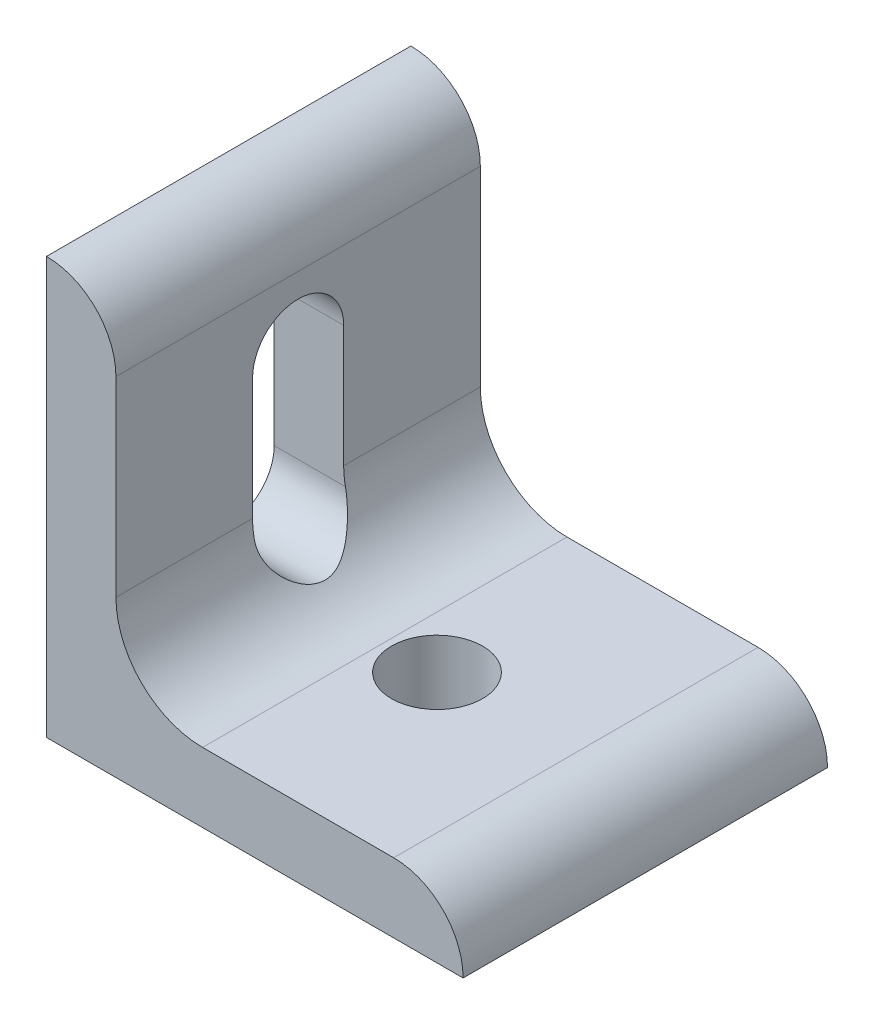
ISO-10303-21;
HEADER;
FILE_DESCRIPTION(('STEP AP214'),'2;1');
FILE_NAME('part.step','',(''),(''),'','','');
FILE_SCHEMA(('AUTOMOTIVE_DESIGN { 1 0 10303 214 1 1 1 1 }'));
ENDSEC;
DATA;
#1=APPLICATION_CONTEXT('core data for automotive mechanical design processes');
#2=APPLICATION_PROTOCOL_DEFINITION('international standard','automotive_design',2000,#1);
#3=PRODUCT_CONTEXT('',#1,'mechanical');
#4=PRODUCT('Part','Part','',(#3));
#5=PRODUCT_RELATED_PRODUCT_CATEGORY('part','',(#4));
#6=PRODUCT_DEFINITION_FORMATION('','',#4);
#7=PRODUCT_DEFINITION_CONTEXT('part definition',#1,'design');
#8=PRODUCT_DEFINITION('design','',#6,#7);
#9=PRODUCT_DEFINITION_SHAPE('','',#8);
#10=(LENGTH_UNIT() NAMED_UNIT(*) SI_UNIT(.MILLI.,.METRE.));
#11=(NAMED_UNIT(*) PLANE_ANGLE_UNIT() SI_UNIT($,.RADIAN.));
#12=(NAMED_UNIT(*) SI_UNIT($,.STERADIAN.) SOLID_ANGLE_UNIT());
#13=UNCERTAINTY_MEASURE_WITH_UNIT(LENGTH_MEASURE(1.E-05),#10,'distance_accuracy_value','');
#14=(GEOMETRIC_REPRESENTATION_CONTEXT(3) GLOBAL_UNCERTAINTY_ASSIGNED_CONTEXT((#13)) GLOBAL_UNIT_ASSIGNED_CONTEXT((#10,
#11,#12)) REPRESENTATION_CONTEXT('',''));
#15=CARTESIAN_POINT('',(0.,0.,0.));
#16=DIRECTION('',(0.,0.,1.));
#17=DIRECTION('',(1.,0.,0.));
#18=AXIS2_PLACEMENT_3D('',#15,#16,#17);
#19=CARTESIAN_POINT('',(-19.05,12.7,-16.6624));
#20=DIRECTION('',(0.,0.,1.));
#21=DIRECTION('',(1.,0.,0.));
#22=AXIS2_PLACEMENT_3D('',#19,#20,#21);
#23=CYLINDRICAL_SURFACE('',#22,6.35);
#24=DIRECTION('',(0.,0.,1.));
#25=VECTOR('',#24,1.);
#26=CARTESIAN_POINT('',(-19.05,19.05,-16.6624));
#27=LINE('',#26,#25);
#28=CARTESIAN_POINT('',(-19.05,19.05,-16.6624));
#29=VERTEX_POINT('',#28);
#30=CARTESIAN_POINT('',(-19.05,19.05,16.6624));
#31=VERTEX_POINT('',#30);
#32=EDGE_CURVE('E304',#29,#31,#27,.T.);
#33=ORIENTED_EDGE('',*,*,#32,.T.);
#34=CARTESIAN_POINT('',(-19.05,12.7,16.6624));
#35=DIRECTION('',(0.,0.,1.));
#36=DIRECTION('',(1.,0.,0.));
#37=AXIS2_PLACEMENT_3D('',#34,#35,#36);
#38=CIRCLE('',#37,6.35);
#39=CARTESIAN_POINT('',(-12.7,12.7,16.6624));
#40=VERTEX_POINT('',#39);
#41=EDGE_CURVE('E570',#40,#31,#38,.T.);
#42=ORIENTED_EDGE('',*,*,#41,.F.);
#43=DIRECTION('',(0.,0.,1.));
#44=VECTOR('',#43,1.);
#45=CARTESIAN_POINT('',(-12.7,12.7,-16.6624));
#46=LINE('',#45,#44);
#47=CARTESIAN_POINT('',(-12.7,12.7,-16.6624));
#48=VERTEX_POINT('',#47);
#49=EDGE_CURVE('E12',#48,#40,#46,.T.);
#50=ORIENTED_EDGE('',*,*,#49,.F.);
#51=CARTESIAN_POINT('',(-19.05,12.7,-16.6624));
#52=DIRECTION('',(0.,0.,1.));
#53=DIRECTION('',(1.,0.,0.));
#54=AXIS2_PLACEMENT_3D('',#51,#52,#53);
#55=CIRCLE('',#54,6.35);
#56=EDGE_CURVE('E544',#48,#29,#55,.T.);
#57=ORIENTED_EDGE('',*,*,#56,.T.);
#58=EDGE_LOOP('',(#33,#42,#50,#57));
#59=FACE_BOUND('',#58,.T.);
#60=ADVANCED_FACE('F301',(#59),#23,.T.);
#61=CARTESIAN_POINT('',(-12.7,-4.7752,-16.6624));
#62=DIRECTION('',(1.,0.,0.));
#63=DIRECTION('',(0.,0.,-1.));
#64=AXIS2_PLACEMENT_3D('',#61,#62,#63);
#65=PLANE('',#64);
#66=DIRECTION('',(0.,1.,0.));
#67=VECTOR('',#66,1.);
#68=CARTESIAN_POINT('',(-12.7,-4.77520000000001,-4.16560000000001));
#69=LINE('',#68,#67);
#70=CARTESIAN_POINT('',(-12.7,-4.7752,-4.16560000000001));
#71=VERTEX_POINT('',#70);
#72=CARTESIAN_POINT('',(-12.7,6.35,-4.1656));
#73=VERTEX_POINT('',#72);
#74=EDGE_CURVE('E487',#71,#73,#69,.T.);
#75=ORIENTED_EDGE('',*,*,#74,.F.);
#76=DIRECTION('',(0.,0.,1.));
#77=VECTOR('',#76,1.);
#78=CARTESIAN_POINT('',(-12.7,-4.7752,-16.6624));
#79=LINE('',#78,#77);
#80=CARTESIAN_POINT('',(-12.7,-4.7752,-16.6624));
#81=VERTEX_POINT('',#80);
#82=EDGE_CURVE('E310',#81,#71,#79,.T.);
#83=ORIENTED_EDGE('',*,*,#82,.F.);
#84=DIRECTION('',(0.,1.,0.));
#85=VECTOR('',#84,1.);
#86=CARTESIAN_POINT('',(-12.7,-4.7752,-16.6624));
#87=LINE('',#86,#85);
#88=EDGE_CURVE('E520',#81,#48,#87,.T.);
#89=ORIENTED_EDGE('',*,*,#88,.T.);
#90=ORIENTED_EDGE('',*,*,#49,.T.);
#91=DIRECTION('',(0.,1.,0.));
#92=VECTOR('',#91,1.);
#93=CARTESIAN_POINT('',(-12.7,-4.7752,16.6624));
#94=LINE('',#93,#92);
#95=CARTESIAN_POINT('',(-12.7,-4.7752,16.6624));
#96=VERTEX_POINT('',#95);
#97=EDGE_CURVE('E547',#96,#40,#94,.T.);
#98=ORIENTED_EDGE('',*,*,#97,.F.);
#99=CARTESIAN_POINT('',(-12.7,-4.7752,4.16560000000001));
#100=VERTEX_POINT('',#99);
#101=EDGE_CURVE('E499',#100,#96,#79,.T.);
#102=ORIENTED_EDGE('',*,*,#101,.F.);
#103=DIRECTION('',(0.,-1.,0.));
#104=VECTOR('',#103,1.);
#105=CARTESIAN_POINT('',(-12.7,-4.77520000000001,4.16560000000001));
#106=LINE('',#105,#104);
#107=CARTESIAN_POINT('',(-12.7,6.35,4.1656));
#108=VERTEX_POINT('',#107);
#109=EDGE_CURVE('E318',#108,#100,#106,.T.);
#110=ORIENTED_EDGE('',*,*,#109,.F.);
#111=CARTESIAN_POINT('',(-12.7,6.35,0.));
#112=DIRECTION('',(1.,0.,0.));
#113=DIRECTION('',(0.,0.,-1.));
#114=AXIS2_PLACEMENT_3D('',#111,#112,#113);
#115=CIRCLE('',#114,4.1656);
#116=EDGE_CURVE('E400',#73,#108,#115,.T.);
#117=ORIENTED_EDGE('',*,*,#116,.F.);
#118=EDGE_LOOP('',(#75,#83,#89,#90,#98,#102,#110,#117));
#119=FACE_BOUND('',#118,.T.);
#120=ADVANCED_FACE('F476',(#119),#65,.T.);
#121=CARTESIAN_POINT('',(-4.77520000000001,-4.7752,-16.6624));
#122=DIRECTION('',(0.,0.,1.));
#123=DIRECTION('',(1.,0.,0.));
#124=AXIS2_PLACEMENT_3D('',#121,#122,#123);
#125=CYLINDRICAL_SURFACE('',#124,7.9248);
#126=CARTESIAN_POINT('',(-4.77520000000001,-4.7752,-4.16560000000001));
#127=DIRECTION('',(0.,0.,-1.));
#128=DIRECTION('',(0.,1.,0.));
#129=AXIS2_PLACEMENT_3D('',#126,#127,#128);
#130=CIRCLE('',#129,7.9248);
#131=CARTESIAN_POINT('',(-12.5419535045217,-6.35,-4.16560000000001));
#132=VERTEX_POINT('',#131);
#133=EDGE_CURVE('E451',#132,#71,#130,.T.);
#134=ORIENTED_EDGE('',*,*,#133,.F.);
#135=CARTESIAN_POINT('',(-12.5419535045217,-6.35,4.1656));
#136=CARTESIAN_POINT('',(-12.5183677972555,-6.46644192340756,4.16561740535239));
#137=CARTESIAN_POINT('',(-12.4921253503843,-6.58230665657616,4.16071876942945));
#138=CARTESIAN_POINT('',(-12.4347124342698,-6.81191714210821,4.14150664543222));
#139=CARTESIAN_POINT('',(-12.4035461789697,-6.9256646142754,4.12720117520229));
#140=CARTESIAN_POINT('',(-12.3368501972341,-7.14953709792711,4.08971516347229));
#141=CARTESIAN_POINT('',(-12.3013505782604,-7.25968104101088,4.06659372747526));
#142=CARTESIAN_POINT('',(-12.2263025058469,-7.47644072382382,4.0119644114413));
#143=CARTESIAN_POINT('',(-12.1867532822909,-7.58305578734333,3.98045493441524));
#144=CARTESIAN_POINT('',(-12.0630690513076,-7.89601263454088,3.87432865818806));
#145=CARTESIAN_POINT('',(-11.973614662467,-8.09639780699546,3.78795143881343));
#146=CARTESIAN_POINT('',(-11.7849645675482,-8.47806539957021,3.58750983105808));
#147=CARTESIAN_POINT('',(-11.6857491693541,-8.65930760786181,3.47338876021334));
#148=CARTESIAN_POINT('',(-11.4699813110625,-9.02161399683833,3.2049341898041));
#149=CARTESIAN_POINT('',(-11.3527965347514,-9.19991989218349,3.04738262722771));
#150=CARTESIAN_POINT('',(-11.1199276687089,-9.52780854995298,2.70373754837415));
#151=CARTESIAN_POINT('',(-11.0042437072506,-9.67738887211559,2.51764160964141));
#152=CARTESIAN_POINT('',(-10.801497679007,-9.92374103399745,2.14977251920148));
#153=CARTESIAN_POINT('',(-10.7128061049432,-10.0251257718701,1.9719949281517));
#154=CARTESIAN_POINT('',(-10.5510474190907,-10.2025785095014,1.59767764113759));
#155=CARTESIAN_POINT('',(-10.4779512797623,-10.2786936926156,1.40117380436338));
#156=CARTESIAN_POINT('',(-10.3704080288697,-10.3877431182282,1.03748745676759));
#157=CARTESIAN_POINT('',(-10.3309746672691,-10.4265254239609,0.873562635560933));
#158=CARTESIAN_POINT('',(-10.2718246932586,-10.484080929987,0.538824344087069));
#159=CARTESIAN_POINT('',(-10.2520811365067,-10.5028814764687,0.368020621337604));
#160=CARTESIAN_POINT('',(-10.2350633067849,-10.5191113242346,0.0235525068248065));
#161=CARTESIAN_POINT('',(-10.2378775706813,-10.5164564149734,-0.150120484464315));
#162=CARTESIAN_POINT('',(-10.2657457566912,-10.4898031696545,-0.494041966253757));
#163=CARTESIAN_POINT('',(-10.2908190231559,-10.465786268765,-0.664287346324097));
#164=CARTESIAN_POINT('',(-10.3658159378943,-10.3921963096804,-1.02601276038822));
#165=CARTESIAN_POINT('',(-10.4193357580394,-10.3388701966739,-1.21595856593888));
#166=CARTESIAN_POINT('',(-10.5447415080306,-10.2087017632574,-1.5812737039262));
#167=CARTESIAN_POINT('',(-10.6166650118665,-10.1318112682243,-1.75661223077297));
#168=CARTESIAN_POINT('',(-10.7461550586974,-9.98636981896153,-2.03592724447349));
#169=CARTESIAN_POINT('',(-10.8006336783089,-9.92343154677005,-2.14436787754785));
#170=CARTESIAN_POINT('',(-10.9129577545909,-9.7889856904295,-2.35395380195964));
#171=CARTESIAN_POINT('',(-10.9708031584313,-9.71747824072524,-2.45509920771458));
#172=CARTESIAN_POINT('',(-11.088452518857,-9.56628447906911,-2.65009049694284));
#173=CARTESIAN_POINT('',(-11.1482589456436,-9.48658755886661,-2.74392662870047));
#174=CARTESIAN_POINT('',(-11.2684897949261,-9.31945343716514,-2.92397922756216));
#175=CARTESIAN_POINT('',(-11.3289141609528,-9.2320169374414,-3.01019638409209));
#176=CARTESIAN_POINT('',(-11.4502545238825,-9.04818847215568,-3.17609532271023));
#177=CARTESIAN_POINT('',(-11.5111622493259,-8.95167281802575,-3.25564621844662));
#178=CARTESIAN_POINT('',(-11.6313787475931,-8.75124355915059,-3.4061644336177));
#179=CARTESIAN_POINT('',(-11.6906876768444,-8.64733068180483,-3.47713259518089));
#180=CARTESIAN_POINT('',(-11.8065339104966,-8.43274314242526,-3.60974590493582));
#181=CARTESIAN_POINT('',(-11.8630786312437,-8.32208859234431,-3.67141704343744));
#182=CARTESIAN_POINT('',(-11.9726137702034,-8.09418652780175,-3.78500251768188));
#183=CARTESIAN_POINT('',(-12.0256042112055,-7.97693905562212,-3.8369169159877));
#184=CARTESIAN_POINT('',(-12.1253317491077,-7.74064757458649,-3.92858917841972));
#185=CARTESIAN_POINT('',(-12.1722225295559,-7.62180901379256,-3.96870802231849));
#186=CARTESIAN_POINT('',(-12.2610369929945,-7.37930769035314,-4.03839853103678));
#187=CARTESIAN_POINT('',(-12.3029622258882,-7.25564644912254,-4.06797349275737));
#188=CARTESIAN_POINT('',(-12.3814926670789,-7.00327806243865,-4.11607493407713));
#189=CARTESIAN_POINT('',(-12.4180476077657,-6.87453599255591,-4.13450150587616));
#190=CARTESIAN_POINT('',(-12.4848755918818,-6.6141189560806,-4.15928635187596));
#191=CARTESIAN_POINT('',(-12.5151404025939,-6.48244039247404,-4.16562889765033));
#192=CARTESIAN_POINT('',(-12.5419535045217,-6.35,-4.1656));
#193=B_SPLINE_CURVE_WITH_KNOTS('',3,(#135,#136,#137,#138,#139,#140,#141,#142,#143,#144,#145,
#146,#147,#148,#149,#150,#151,#152,#153,#154,#155,#156,#157,#158,#159,#160,#161,#162,#163,#164,
#165,#166,#167,#168,#169,#170,#171,#172,#173,#174,#175,#176,#177,#178,#179,#180,#181,#182,#183,
#184,#185,#186,#187,#188,#189,#190,#191,#192),.UNSPECIFIED.,.F.,.F.,(4,2,2,2,2,2,2,2,2,2,2,2,2,
2,2,2,2,2,2,2,2,2,2,2,2,2,2,2,4),(0.,0.356230564600409,0.712157891644707,1.0657397548369,
1.41938898426377,2.12376165412194,2.82958567821204,3.62213731146315,4.41475624289145,
5.08166429224455,5.74731999275772,6.26425629437072,6.78048422431451,7.29873927905102,
7.81744516857059,8.42741656536719,9.03864339127071,9.44829000204646,9.85793018657468,
10.2681078534863,10.6782483661516,11.0951378285751,11.5119863530162,11.9276470386122,
12.3433050587822,12.7444590989697,13.1454875945491,13.5500586889426,13.955156009535),.UNSPECIFIED.);
#194=CARTESIAN_POINT('',(-12.5419535045217,-6.35,4.16560000000001));
#195=VERTEX_POINT('',#194);
#196=EDGE_CURVE('E442',#195,#132,#193,.T.);
#197=ORIENTED_EDGE('',*,*,#196,.F.);
#198=CARTESIAN_POINT('',(-4.77520000000001,-4.7752,4.16560000000001));
#199=DIRECTION('',(0.,0.,1.));
#200=DIRECTION('',(0.,-1.,0.));
#201=AXIS2_PLACEMENT_3D('',#198,#199,#200);
#202=CIRCLE('',#201,7.9248);
#203=EDGE_CURVE('E431',#100,#195,#202,.T.);
#204=ORIENTED_EDGE('',*,*,#203,.F.);
#205=ORIENTED_EDGE('',*,*,#101,.T.);
#206=CARTESIAN_POINT('',(-4.77520000000001,-4.7752,16.6624));
#207=DIRECTION('',(0.,0.,-1.));
#208=DIRECTION('',(-1.,0.,0.));
#209=AXIS2_PLACEMENT_3D('',#206,#207,#208);
#210=CIRCLE('',#209,7.9248);
#211=CARTESIAN_POINT('',(-4.77520000000001,-12.7,16.6624));
#212=VERTEX_POINT('',#211);
#213=EDGE_CURVE('E551',#212,#96,#210,.T.);
#214=ORIENTED_EDGE('',*,*,#213,.F.);
#215=DIRECTION('',(0.,0.,1.));
#216=VECTOR('',#215,1.);
#217=CARTESIAN_POINT('',(-4.77520000000001,-12.7,-16.6624));
#218=LINE('',#217,#216);
#219=CARTESIAN_POINT('',(-4.77520000000001,-12.7,-16.6624));
#220=VERTEX_POINT('',#219);
#221=EDGE_CURVE('E503',#220,#212,#218,.T.);
#222=ORIENTED_EDGE('',*,*,#221,.F.);
#223=CARTESIAN_POINT('',(-4.77520000000001,-4.7752,-16.6624));
#224=DIRECTION('',(0.,0.,-1.));
#225=DIRECTION('',(-1.,0.,0.));
#226=AXIS2_PLACEMENT_3D('',#223,#224,#225);
#227=CIRCLE('',#226,7.9248);
#228=EDGE_CURVE('E496',#220,#81,#227,.T.);
#229=ORIENTED_EDGE('',*,*,#228,.T.);
#230=ORIENTED_EDGE('',*,*,#82,.T.);
#231=EDGE_LOOP('',(#134,#197,#204,#205,#214,#222,#229,#230));
#232=FACE_BOUND('',#231,.T.);
#233=ADVANCED_FACE('F453',(#232),#125,.F.);
#234=CARTESIAN_POINT('',(12.7,-12.7,-16.6624));
#235=DIRECTION('',(0.,1.,0.));
#236=DIRECTION('',(-1.,0.,0.));
#237=AXIS2_PLACEMENT_3D('',#234,#235,#236);
#238=PLANE('',#237);
#239=CARTESIAN_POINT('',(0.,-12.7,0.));
#240=DIRECTION('',(0.,1.,0.));
#241=DIRECTION('',(-1.,0.,0.));
#242=AXIS2_PLACEMENT_3D('',#239,#240,#241);
#243=CIRCLE('',#242,4.1656);
#244=CARTESIAN_POINT('',(-4.1656,-12.7,0.));
#245=VERTEX_POINT('',#244);
#246=EDGE_CURVE('E420',#245,#245,#243,.T.);
#247=ORIENTED_EDGE('',*,*,#246,.F.);
#248=EDGE_LOOP('',(#247));
#249=FACE_BOUND('',#248,.T.);
#250=ORIENTED_EDGE('',*,*,#221,.T.);
#251=DIRECTION('',(-1.,0.,0.));
#252=VECTOR('',#251,1.);
#253=CARTESIAN_POINT('',(12.7,-12.7,16.6624));
#254=LINE('',#253,#252);
#255=CARTESIAN_POINT('',(12.7,-12.7,16.6624));
#256=VERTEX_POINT('',#255);
#257=EDGE_CURVE('E555',#256,#212,#254,.T.);
#258=ORIENTED_EDGE('',*,*,#257,.F.);
#259=DIRECTION('',(0.,0.,1.));
#260=VECTOR('',#259,1.);
#261=CARTESIAN_POINT('',(12.7,-12.7,-16.6624));
#262=LINE('',#261,#260);
#263=CARTESIAN_POINT('',(12.7,-12.7,-16.6624));
#264=VERTEX_POINT('',#263);
#265=EDGE_CURVE('E508',#264,#256,#262,.T.);
#266=ORIENTED_EDGE('',*,*,#265,.F.);
#267=DIRECTION('',(-1.,0.,0.));
#268=VECTOR('',#267,1.);
#269=CARTESIAN_POINT('',(12.7,-12.7,-16.6624));
#270=LINE('',#269,#268);
#271=EDGE_CURVE('E527',#264,#220,#270,.T.);
#272=ORIENTED_EDGE('',*,*,#271,.T.);
#273=EDGE_LOOP('',(#250,#258,#266,#272));
#274=FACE_BOUND('',#273,.T.);
#275=ADVANCED_FACE('F482',(#249,#274),#238,.T.);
#276=CARTESIAN_POINT('',(12.7,-19.05,-16.6624));
#277=DIRECTION('',(0.,0.,1.));
#278=DIRECTION('',(1.,0.,0.));
#279=AXIS2_PLACEMENT_3D('',#276,#277,#278);
#280=CYLINDRICAL_SURFACE('',#279,6.35);
#281=ORIENTED_EDGE('',*,*,#265,.T.);
#282=CARTESIAN_POINT('',(12.7,-19.05,16.6624));
#283=DIRECTION('',(0.,0.,1.));
#284=DIRECTION('',(-1.,0.,0.));
#285=AXIS2_PLACEMENT_3D('',#282,#283,#284);
#286=CIRCLE('',#285,6.35);
#287=CARTESIAN_POINT('',(19.05,-19.05,16.6624));
#288=VERTEX_POINT('',#287);
#289=EDGE_CURVE('E559',#288,#256,#286,.T.);
#290=ORIENTED_EDGE('',*,*,#289,.F.);
#291=DIRECTION('',(0.,0.,1.));
#292=VECTOR('',#291,1.);
#293=CARTESIAN_POINT('',(19.05,-19.05,-16.6624));
#294=LINE('',#293,#292);
#295=CARTESIAN_POINT('',(19.05,-19.05,-16.6624));
#296=VERTEX_POINT('',#295);
#297=EDGE_CURVE('E511',#296,#288,#294,.T.);
#298=ORIENTED_EDGE('',*,*,#297,.F.);
#299=CARTESIAN_POINT('',(12.7,-19.05,-16.6624));
#300=DIRECTION('',(0.,0.,1.));
#301=DIRECTION('',(-1.,0.,0.));
#302=AXIS2_PLACEMENT_3D('',#299,#300,#301);
#303=CIRCLE('',#302,6.35);
#304=EDGE_CURVE('E533',#296,#264,#303,.T.);
#305=ORIENTED_EDGE('',*,*,#304,.T.);
#306=EDGE_LOOP('',(#281,#290,#298,#305));
#307=FACE_BOUND('',#306,.T.);
#308=ADVANCED_FACE('F602',(#307),#280,.T.);
#309=CARTESIAN_POINT('',(-19.05,-19.05,-16.6624));
#310=DIRECTION('',(0.,-1.,0.));
#311=DIRECTION('',(0.,0.,-1.));
#312=AXIS2_PLACEMENT_3D('',#309,#310,#311);
#313=PLANE('',#312);
#314=CARTESIAN_POINT('',(0.,-19.05,0.));
#315=DIRECTION('',(0.,1.,0.));
#316=DIRECTION('',(-1.,0.,0.));
#317=AXIS2_PLACEMENT_3D('',#314,#315,#316);
#318=CIRCLE('',#317,4.1656);
#319=CARTESIAN_POINT('',(-4.1656,-19.05,0.));
#320=VERTEX_POINT('',#319);
#321=EDGE_CURVE('E415',#320,#320,#318,.T.);
#322=ORIENTED_EDGE('',*,*,#321,.T.);
#323=EDGE_LOOP('',(#322));
#324=FACE_BOUND('',#323,.T.);
#325=ORIENTED_EDGE('',*,*,#297,.T.);
#326=DIRECTION('',(1.,0.,0.));
#327=VECTOR('',#326,1.);
#328=CARTESIAN_POINT('',(-19.05,-19.05,16.6624));
#329=LINE('',#328,#327);
#330=CARTESIAN_POINT('',(-19.05,-19.05,16.6624));
#331=VERTEX_POINT('',#330);
#332=EDGE_CURVE('E563',#331,#288,#329,.T.);
#333=ORIENTED_EDGE('',*,*,#332,.F.);
#334=DIRECTION('',(0.,0.,1.));
#335=VECTOR('',#334,1.);
#336=CARTESIAN_POINT('',(-19.05,-19.05,-16.6624));
#337=LINE('',#336,#335);
#338=CARTESIAN_POINT('',(-19.05,-19.05,-16.6624));
#339=VERTEX_POINT('',#338);
#340=EDGE_CURVE('E513',#339,#331,#337,.T.);
#341=ORIENTED_EDGE('',*,*,#340,.F.);
#342=DIRECTION('',(1.,0.,0.));
#343=VECTOR('',#342,1.);
#344=CARTESIAN_POINT('',(-19.05,-19.05,-16.6624));
#345=LINE('',#344,#343);
#346=EDGE_CURVE('E537',#339,#296,#345,.T.);
#347=ORIENTED_EDGE('',*,*,#346,.T.);
#348=EDGE_LOOP('',(#325,#333,#341,#347));
#349=FACE_BOUND('',#348,.T.);
#350=ADVANCED_FACE('F600',(#324,#349),#313,.T.);
#351=CARTESIAN_POINT('',(-19.05,19.05,-16.6624));
#352=DIRECTION('',(-1.,0.,0.));
#353=DIRECTION('',(0.,-1.,0.));
#354=AXIS2_PLACEMENT_3D('',#351,#352,#353);
#355=PLANE('',#354);
#356=CARTESIAN_POINT('',(-19.05,6.35,0.));
#357=DIRECTION('',(1.,0.,0.));
#358=DIRECTION('',(0.,0.,-1.));
#359=AXIS2_PLACEMENT_3D('',#356,#357,#358);
#360=CIRCLE('',#359,4.1656);
#361=CARTESIAN_POINT('',(-19.05,6.35,-4.1656));
#362=VERTEX_POINT('',#361);
#363=CARTESIAN_POINT('',(-19.05,6.35,4.1656));
#364=VERTEX_POINT('',#363);
#365=EDGE_CURVE('E397',#362,#364,#360,.T.);
#366=ORIENTED_EDGE('',*,*,#365,.T.);
#367=DIRECTION('',(0.,-1.,0.));
#368=VECTOR('',#367,1.);
#369=CARTESIAN_POINT('',(-19.05,6.35,4.1656));
#370=LINE('',#369,#368);
#371=CARTESIAN_POINT('',(-19.05,-6.34999999999999,4.1656));
#372=VERTEX_POINT('',#371);
#373=EDGE_CURVE('E406',#364,#372,#370,.T.);
#374=ORIENTED_EDGE('',*,*,#373,.T.);
#375=CARTESIAN_POINT('',(-19.05,-6.35,0.));
#376=DIRECTION('',(1.,0.,0.));
#377=DIRECTION('',(0.,0.,-1.));
#378=AXIS2_PLACEMENT_3D('',#375,#376,#377);
#379=CIRCLE('',#378,4.1656);
#380=CARTESIAN_POINT('',(-19.05,-6.35,-4.16560000000001));
#381=VERTEX_POINT('',#380);
#382=EDGE_CURVE('E326',#372,#381,#379,.T.);
#383=ORIENTED_EDGE('',*,*,#382,.T.);
#384=DIRECTION('',(0.,1.,0.));
#385=VECTOR('',#384,1.);
#386=CARTESIAN_POINT('',(-19.05,6.35,-4.1656));
#387=LINE('',#386,#385);
#388=EDGE_CURVE('E403',#381,#362,#387,.T.);
#389=ORIENTED_EDGE('',*,*,#388,.T.);
#390=EDGE_LOOP('',(#366,#374,#383,#389));
#391=FACE_BOUND('',#390,.T.);
#392=ORIENTED_EDGE('',*,*,#340,.T.);
#393=DIRECTION('',(0.,-1.,0.));
#394=VECTOR('',#393,1.);
#395=CARTESIAN_POINT('',(-19.05,19.05,16.6624));
#396=LINE('',#395,#394);
#397=EDGE_CURVE('E567',#31,#331,#396,.T.);
#398=ORIENTED_EDGE('',*,*,#397,.F.);
#399=ORIENTED_EDGE('',*,*,#32,.F.);
#400=DIRECTION('',(0.,-1.,0.));
#401=VECTOR('',#400,1.);
#402=CARTESIAN_POINT('',(-19.05,19.05,-16.6624));
#403=LINE('',#402,#401);
#404=EDGE_CURVE('E541',#29,#339,#403,.T.);
#405=ORIENTED_EDGE('',*,*,#404,.T.);
#406=EDGE_LOOP('',(#392,#398,#399,#405));
#407=FACE_BOUND('',#406,.T.);
#408=ADVANCED_FACE('F411',(#391,#407),#355,.T.);
#409=CARTESIAN_POINT('',(-19.05,12.7,-16.6624));
#410=DIRECTION('',(0.,0.,1.));
#411=DIRECTION('',(1.,0.,0.));
#412=AXIS2_PLACEMENT_3D('',#409,#410,#411);
#413=PLANE('',#412);
#414=ORIENTED_EDGE('',*,*,#56,.F.);
#415=ORIENTED_EDGE('',*,*,#88,.F.);
#416=ORIENTED_EDGE('',*,*,#228,.F.);
#417=ORIENTED_EDGE('',*,*,#271,.F.);
#418=ORIENTED_EDGE('',*,*,#304,.F.);
#419=ORIENTED_EDGE('',*,*,#346,.F.);
#420=ORIENTED_EDGE('',*,*,#404,.F.);
#421=EDGE_LOOP('',(#414,#415,#416,#417,#418,#419,#420));
#422=FACE_BOUND('',#421,.T.);
#423=ADVANCED_FACE('F472',(#422),#413,.F.);
#424=CARTESIAN_POINT('',(-19.05,12.7,16.6624));
#425=DIRECTION('',(0.,0.,1.));
#426=DIRECTION('',(1.,0.,0.));
#427=AXIS2_PLACEMENT_3D('',#424,#425,#426);
#428=PLANE('',#427);
#429=ORIENTED_EDGE('',*,*,#41,.T.);
#430=ORIENTED_EDGE('',*,*,#397,.T.);
#431=ORIENTED_EDGE('',*,*,#332,.T.);
#432=ORIENTED_EDGE('',*,*,#289,.T.);
#433=ORIENTED_EDGE('',*,*,#257,.T.);
#434=ORIENTED_EDGE('',*,*,#213,.T.);
#435=ORIENTED_EDGE('',*,*,#97,.T.);
#436=EDGE_LOOP('',(#429,#430,#431,#432,#433,#434,#435));
#437=FACE_BOUND('',#436,.T.);
#438=ADVANCED_FACE('F469',(#437),#428,.T.);
#439=CARTESIAN_POINT('',(-19.05,6.35,0.));
#440=DIRECTION('',(1.,0.,0.));
#441=DIRECTION('',(0.,0.,-1.));
#442=AXIS2_PLACEMENT_3D('',#439,#440,#441);
#443=CYLINDRICAL_SURFACE('',#442,4.1656);
#444=ORIENTED_EDGE('',*,*,#116,.T.);
#445=DIRECTION('',(1.,0.,0.));
#446=VECTOR('',#445,1.);
#447=CARTESIAN_POINT('',(-19.05,6.35,4.1656));
#448=LINE('',#447,#446);
#449=EDGE_CURVE('E392',#364,#108,#448,.T.);
#450=ORIENTED_EDGE('',*,*,#449,.F.);
#451=ORIENTED_EDGE('',*,*,#365,.F.);
#452=DIRECTION('',(1.,0.,0.));
#453=VECTOR('',#452,1.);
#454=CARTESIAN_POINT('',(-19.05,6.35,-4.1656));
#455=LINE('',#454,#453);
#456=EDGE_CURVE('E428',#362,#73,#455,.T.);
#457=ORIENTED_EDGE('',*,*,#456,.T.);
#458=EDGE_LOOP('',(#444,#450,#451,#457));
#459=FACE_BOUND('',#458,.T.);
#460=ADVANCED_FACE('F394',(#459),#443,.F.);
#461=CARTESIAN_POINT('',(-19.05,6.35,-4.1656));
#462=DIRECTION('',(0.,0.,-1.));
#463=DIRECTION('',(0.,1.,0.));
#464=AXIS2_PLACEMENT_3D('',#461,#462,#463);
#465=PLANE('',#464);
#466=ORIENTED_EDGE('',*,*,#74,.T.);
#467=ORIENTED_EDGE('',*,*,#456,.F.);
#468=ORIENTED_EDGE('',*,*,#388,.F.);
#469=DIRECTION('',(1.,0.,0.));
#470=VECTOR('',#469,1.);
#471=CARTESIAN_POINT('',(-19.05,-6.35,-4.16560000000001));
#472=LINE('',#471,#470);
#473=EDGE_CURVE('E432',#381,#132,#472,.T.);
#474=ORIENTED_EDGE('',*,*,#473,.T.);
#475=ORIENTED_EDGE('',*,*,#133,.T.);
#476=EDGE_LOOP('',(#466,#467,#468,#474,#475));
#477=FACE_BOUND('',#476,.T.);
#478=ADVANCED_FACE('F462',(#477),#465,.F.);
#479=CARTESIAN_POINT('',(-19.05,-6.35,0.));
#480=DIRECTION('',(1.,0.,0.));
#481=DIRECTION('',(0.,0.,-1.));
#482=AXIS2_PLACEMENT_3D('',#479,#480,#481);
#483=CYLINDRICAL_SURFACE('',#482,4.1656);
#484=ORIENTED_EDGE('',*,*,#196,.T.);
#485=ORIENTED_EDGE('',*,*,#473,.F.);
#486=ORIENTED_EDGE('',*,*,#382,.F.);
#487=DIRECTION('',(1.,0.,0.));
#488=VECTOR('',#487,1.);
#489=CARTESIAN_POINT('',(-19.05,-6.35,4.1656));
#490=LINE('',#489,#488);
#491=EDGE_CURVE('E402',#372,#195,#490,.T.);
#492=ORIENTED_EDGE('',*,*,#491,.T.);
#493=EDGE_LOOP('',(#484,#485,#486,#492));
#494=FACE_BOUND('',#493,.T.);
#495=ADVANCED_FACE('F457',(#494),#483,.F.);
#496=CARTESIAN_POINT('',(-19.05,6.35,4.1656));
#497=DIRECTION('',(0.,0.,1.));
#498=DIRECTION('',(0.,-1.,0.));
#499=AXIS2_PLACEMENT_3D('',#496,#497,#498);
#500=PLANE('',#499);
#501=ORIENTED_EDGE('',*,*,#109,.T.);
#502=ORIENTED_EDGE('',*,*,#203,.T.);
#503=ORIENTED_EDGE('',*,*,#491,.F.);
#504=ORIENTED_EDGE('',*,*,#373,.F.);
#505=ORIENTED_EDGE('',*,*,#449,.T.);
#506=EDGE_LOOP('',(#501,#502,#503,#504,#505));
#507=FACE_BOUND('',#506,.T.);
#508=ADVANCED_FACE('F407',(#507),#500,.F.);
#509=CARTESIAN_POINT('',(0.,-19.05,0.));
#510=DIRECTION('',(0.,1.,0.));
#511=DIRECTION('',(-1.,0.,0.));
#512=AXIS2_PLACEMENT_3D('',#509,#510,#511);
#513=CYLINDRICAL_SURFACE('',#512,4.1656);
#514=CARTESIAN_POINT('',(-4.1656,-19.05,0.));
#515=CARTESIAN_POINT('',(-4.1656,-18.9838541666667,0.));
#516=CARTESIAN_POINT('',(-4.1656,-18.9177083333333,0.));
#517=CARTESIAN_POINT('',(-4.1656,-18.7854166666667,0.));
#518=CARTESIAN_POINT('',(-4.1656,-18.7192708333333,0.));
#519=CARTESIAN_POINT('',(-4.1656,-18.5869791666667,0.));
#520=CARTESIAN_POINT('',(-4.1656,-18.5208333333333,0.));
#521=CARTESIAN_POINT('',(-4.1656,-18.3885416666667,0.));
#522=CARTESIAN_POINT('',(-4.1656,-18.3223958333333,0.));
#523=CARTESIAN_POINT('',(-4.1656,-18.1901041666667,0.));
#524=CARTESIAN_POINT('',(-4.1656,-18.1239583333333,0.));
#525=CARTESIAN_POINT('',(-4.1656,-17.9916666666667,0.));
#526=CARTESIAN_POINT('',(-4.1656,-17.9255208333333,0.));
#527=CARTESIAN_POINT('',(-4.1656,-17.7932291666667,0.));
#528=CARTESIAN_POINT('',(-4.1656,-17.7270833333333,0.));
#529=CARTESIAN_POINT('',(-4.1656,-17.5947916666667,0.));
#530=CARTESIAN_POINT('',(-4.1656,-17.5286458333333,0.));
#531=CARTESIAN_POINT('',(-4.1656,-17.3963541666667,0.));
#532=CARTESIAN_POINT('',(-4.1656,-17.3302083333333,0.));
#533=CARTESIAN_POINT('',(-4.1656,-17.1979166666667,0.));
#534=CARTESIAN_POINT('',(-4.1656,-17.1317708333333,0.));
#535=CARTESIAN_POINT('',(-4.1656,-16.9994791666667,0.));
#536=CARTESIAN_POINT('',(-4.1656,-16.9333333333333,0.));
#537=CARTESIAN_POINT('',(-4.1656,-16.8010416666667,0.));
#538=CARTESIAN_POINT('',(-4.1656,-16.7348958333333,0.));
#539=CARTESIAN_POINT('',(-4.1656,-16.6026041666667,0.));
#540=CARTESIAN_POINT('',(-4.1656,-16.5364583333333,0.));
#541=CARTESIAN_POINT('',(-4.1656,-16.4041666666667,0.));
#542=CARTESIAN_POINT('',(-4.1656,-16.3380208333333,0.));
#543=CARTESIAN_POINT('',(-4.1656,-16.2057291666667,0.));
#544=CARTESIAN_POINT('',(-4.1656,-16.1395833333333,0.));
#545=CARTESIAN_POINT('',(-4.1656,-16.0072916666667,0.));
#546=CARTESIAN_POINT('',(-4.1656,-15.9411458333333,0.));
#547=CARTESIAN_POINT('',(-4.1656,-15.8088541666667,0.));
#548=CARTESIAN_POINT('',(-4.1656,-15.7427083333333,0.));
#549=CARTESIAN_POINT('',(-4.1656,-15.6104166666667,0.));
#550=CARTESIAN_POINT('',(-4.1656,-15.5442708333333,0.));
#551=CARTESIAN_POINT('',(-4.1656,-15.4119791666667,0.));
#552=CARTESIAN_POINT('',(-4.1656,-15.3458333333333,0.));
#553=CARTESIAN_POINT('',(-4.1656,-15.2135416666667,0.));
#554=CARTESIAN_POINT('',(-4.1656,-15.1473958333333,0.));
#555=CARTESIAN_POINT('',(-4.1656,-15.0151041666667,0.));
#556=CARTESIAN_POINT('',(-4.1656,-14.9489583333333,0.));
#557=CARTESIAN_POINT('',(-4.1656,-14.8166666666667,0.));
#558=CARTESIAN_POINT('',(-4.1656,-14.7505208333333,0.));
#559=CARTESIAN_POINT('',(-4.1656,-14.6182291666667,0.));
#560=CARTESIAN_POINT('',(-4.1656,-14.5520833333333,0.));
#561=CARTESIAN_POINT('',(-4.1656,-14.4197916666667,0.));
#562=CARTESIAN_POINT('',(-4.1656,-14.3536458333333,0.));
#563=CARTESIAN_POINT('',(-4.1656,-14.2213541666667,0.));
#564=CARTESIAN_POINT('',(-4.1656,-14.1552083333333,0.));
#565=CARTESIAN_POINT('',(-4.1656,-14.0229166666667,0.));
#566=CARTESIAN_POINT('',(-4.1656,-13.9567708333333,0.));
#567=CARTESIAN_POINT('',(-4.1656,-13.8244791666667,0.));
#568=CARTESIAN_POINT('',(-4.1656,-13.7583333333333,0.));
#569=CARTESIAN_POINT('',(-4.1656,-13.6260416666667,0.));
#570=CARTESIAN_POINT('',(-4.1656,-13.5598958333333,0.));
#571=CARTESIAN_POINT('',(-4.1656,-13.4276041666667,0.));
#572=CARTESIAN_POINT('',(-4.1656,-13.3614583333333,0.));
#573=CARTESIAN_POINT('',(-4.1656,-13.2291666666667,0.));
#574=CARTESIAN_POINT('',(-4.1656,-13.1630208333333,0.));
#575=CARTESIAN_POINT('',(-4.1656,-13.0307291666667,0.));
#576=CARTESIAN_POINT('',(-4.1656,-12.9645833333333,0.));
#577=CARTESIAN_POINT('',(-4.1656,-12.8322916666667,0.));
#578=CARTESIAN_POINT('',(-4.1656,-12.7661458333333,0.));
#579=CARTESIAN_POINT('',(-4.1656,-12.7,0.));
#580=B_SPLINE_CURVE_WITH_KNOTS('',3,(#514,#515,#516,#517,#518,#519,#520,#521,#522,#523,#524,
#525,#526,#527,#528,#529,#530,#531,#532,#533,#534,#535,#536,#537,#538,#539,#540,#541,#542,#543,
#544,#545,#546,#547,#548,#549,#550,#551,#552,#553,#554,#555,#556,#557,#558,#559,#560,#561,#562,
#563,#564,#565,#566,#567,#568,#569,#570,#571,#572,#573,#574,#575,#576,#577,#578,#579),
.UNSPECIFIED.,.F.,.F.,(4,2,2,2,2,2,2,2,2,2,2,2,2,2,2,2,2,2,2,2,2,2,2,2,2,2,2,2,2,2,2,2,4),(0.,
0.198437499999999,0.396874999999998,0.595312499999997,0.793749999999999,0.992187499999998,
1.190625,1.3890625,1.5875,1.7859375,1.984375,2.1828125,2.38125,2.5796875,2.778125,2.9765625,
3.175,3.3734375,3.571875,3.7703125,3.96875,4.1671875,4.365625,4.5640625,4.7625,4.9609375,
5.159375,5.3578125,5.55625,5.7546875,5.953125,6.1515625,6.35),.UNSPECIFIED.);
#581=EDGE_CURVE('BSEAM466',#320,#245,#580,.T.);
#582=ORIENTED_EDGE('',*,*,#321,.F.);
#583=ORIENTED_EDGE('',*,*,#246,.T.);
#584=ORIENTED_EDGE('',*,*,#581,.T.);
#585=ORIENTED_EDGE('',*,*,#581,.F.);
#586=EDGE_LOOP('',(#582,#584,#583,#585));
#587=FACE_BOUND('',#586,.T.);
#588=ADVANCED_FACE('F466',(#587),#513,.F.);
#589=CLOSED_SHELL('',(#60,#120,#233,#275,#308,#350,#408,#423,#438,#460,#478,#495,#508,#588));
#590=MANIFOLD_SOLID_BREP('B2',#589);
#591=ADVANCED_BREP_SHAPE_REPRESENTATION('',(#18,#590),#14);
#592=SHAPE_DEFINITION_REPRESENTATION(#9,#591);
ENDSEC;
END-ISO-10303-21;
